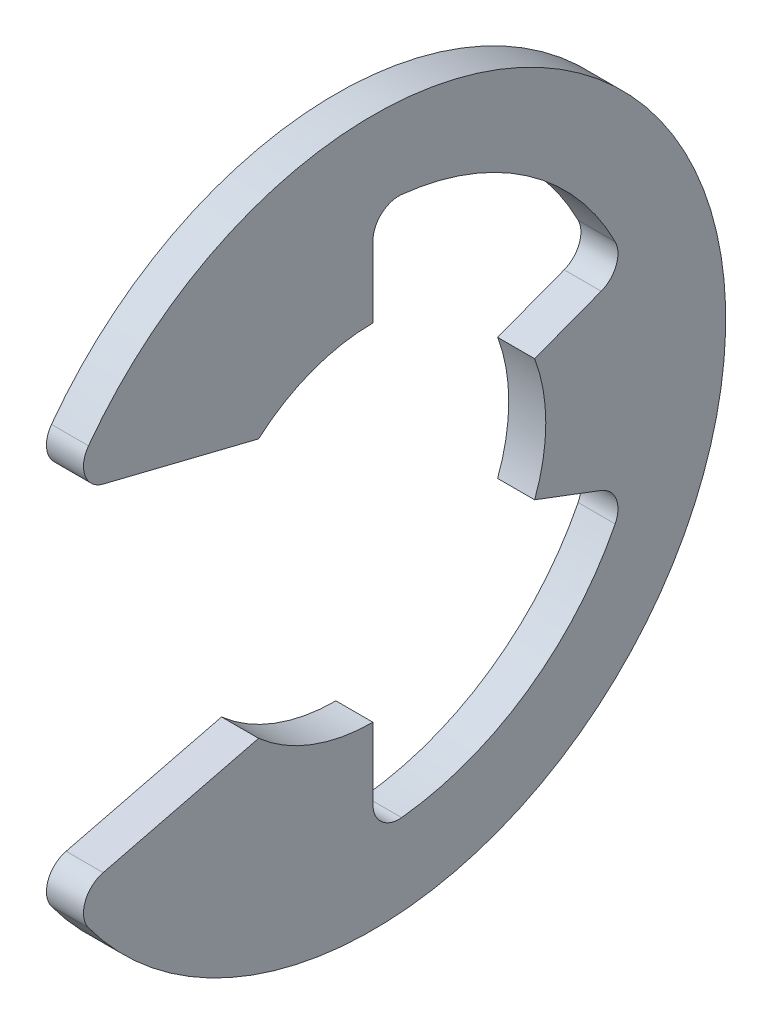
ISO-10303-21;
HEADER;
FILE_DESCRIPTION(('STEP AP214'),'2;1');
FILE_NAME('part.step','',(''),(''),'','','');
FILE_SCHEMA(('AUTOMOTIVE_DESIGN { 1 0 10303 214 1 1 1 1 }'));
ENDSEC;
DATA;
#1=APPLICATION_CONTEXT('core data for automotive mechanical design processes');
#2=APPLICATION_PROTOCOL_DEFINITION('international standard','automotive_design',2000,#1);
#3=PRODUCT_CONTEXT('',#1,'mechanical');
#4=PRODUCT('Part','Part','',(#3));
#5=PRODUCT_RELATED_PRODUCT_CATEGORY('part','',(#4));
#6=PRODUCT_DEFINITION_FORMATION('','',#4);
#7=PRODUCT_DEFINITION_CONTEXT('part definition',#1,'design');
#8=PRODUCT_DEFINITION('design','',#6,#7);
#9=PRODUCT_DEFINITION_SHAPE('','',#8);
#10=(LENGTH_UNIT() NAMED_UNIT(*) SI_UNIT(.MILLI.,.METRE.));
#11=(NAMED_UNIT(*) PLANE_ANGLE_UNIT() SI_UNIT($,.RADIAN.));
#12=(NAMED_UNIT(*) SI_UNIT($,.STERADIAN.) SOLID_ANGLE_UNIT());
#13=UNCERTAINTY_MEASURE_WITH_UNIT(LENGTH_MEASURE(1.E-05),#10,'distance_accuracy_value','');
#14=(GEOMETRIC_REPRESENTATION_CONTEXT(3) GLOBAL_UNCERTAINTY_ASSIGNED_CONTEXT((#13)) GLOBAL_UNIT_ASSIGNED_CONTEXT((#10,
#11,#12)) REPRESENTATION_CONTEXT('',''));
#15=CARTESIAN_POINT('',(0.,0.,0.));
#16=DIRECTION('',(0.,0.,1.));
#17=DIRECTION('',(1.,0.,0.));
#18=AXIS2_PLACEMENT_3D('',#15,#16,#17);
#19=CARTESIAN_POINT('',(0.5334,0.,0.));
#20=DIRECTION('',(-1.,0.,0.));
#21=DIRECTION('',(0.,0.,1.));
#22=AXIS2_PLACEMENT_3D('',#19,#20,#21);
#23=CYLINDRICAL_SURFACE('',#22,10.16);
#24=CARTESIAN_POINT('',(0.5334,0.,0.));
#25=DIRECTION('',(1.,0.,0.));
#26=DIRECTION('',(0.,0.,-1.));
#27=AXIS2_PLACEMENT_3D('',#24,#25,#26);
#28=CIRCLE('',#27,10.16);
#29=CARTESIAN_POINT('',(0.5334,-6.01157023801035,8.19064242129201));
#30=VERTEX_POINT('',#29);
#31=CARTESIAN_POINT('',(0.5334,6.01157023801035,8.19064242129201));
#32=VERTEX_POINT('',#31);
#33=EDGE_CURVE('E173',#30,#32,#28,.T.);
#34=ORIENTED_EDGE('',*,*,#33,.F.);
#35=DIRECTION('',(-1.,0.,0.));
#36=VECTOR('',#35,1.);
#37=CARTESIAN_POINT('',(0.5334,-6.01157023801035,8.19064242129201));
#38=LINE('',#37,#36);
#39=CARTESIAN_POINT('',(-0.5334,-6.01157023801035,8.19064242129201));
#40=VERTEX_POINT('',#39);
#41=EDGE_CURVE('E267',#30,#40,#38,.T.);
#42=ORIENTED_EDGE('',*,*,#41,.T.);
#43=CARTESIAN_POINT('',(-0.5334,0.,0.));
#44=DIRECTION('',(1.,0.,0.));
#45=DIRECTION('',(0.,0.,-1.));
#46=AXIS2_PLACEMENT_3D('',#43,#44,#45);
#47=CIRCLE('',#46,10.16);
#48=CARTESIAN_POINT('',(-0.5334,6.01157023801035,8.19064242129201));
#49=VERTEX_POINT('',#48);
#50=EDGE_CURVE('E211',#40,#49,#47,.T.);
#51=ORIENTED_EDGE('',*,*,#50,.T.);
#52=DIRECTION('',(-1.,0.,0.));
#53=VECTOR('',#52,1.);
#54=CARTESIAN_POINT('',(0.5334,6.01157023801035,8.19064242129201));
#55=LINE('',#54,#53);
#56=EDGE_CURVE('E265',#49,#32,#55,.F.);
#57=ORIENTED_EDGE('',*,*,#56,.T.);
#58=EDGE_LOOP('',(#34,#42,#51,#57));
#59=FACE_BOUND('',#58,.T.);
#60=ADVANCED_FACE('F35',(#59),#23,.T.);
#61=CARTESIAN_POINT('',(0.5334,5.09813480407811,8.78832302088672));
#62=DIRECTION('',(0.,0.970536829925373,-0.240952820606873));
#63=DIRECTION('',(0.,0.240952820606873,0.970536829925373));
#64=AXIS2_PLACEMENT_3D('',#61,#62,#63);
#65=PLANE('',#64);
#66=DIRECTION('',(0.,-0.240952820606873,-0.970536829925373));
#67=VECTOR('',#66,1.);
#68=CARTESIAN_POINT('',(0.5334,5.09813480407811,8.78832302088672));
#69=LINE('',#68,#67);
#70=CARTESIAN_POINT('',(0.5334,4.84496174240152,7.76856413164343));
#71=VERTEX_POINT('',#70);
#72=CARTESIAN_POINT('',(0.5334,3.7338,3.29290208175099));
#73=VERTEX_POINT('',#72);
#74=EDGE_CURVE('E159',#71,#73,#69,.T.);
#75=ORIENTED_EDGE('',*,*,#74,.F.);
#76=DIRECTION('',(-1.,0.,0.));
#77=VECTOR('',#76,1.);
#78=CARTESIAN_POINT('',(0.5334,4.84496174240152,7.76856413164343));
#79=LINE('',#78,#77);
#80=CARTESIAN_POINT('',(-0.5334,4.84496174240152,7.76856413164343));
#81=VERTEX_POINT('',#80);
#82=EDGE_CURVE('E279',#71,#81,#79,.T.);
#83=ORIENTED_EDGE('',*,*,#82,.T.);
#84=DIRECTION('',(0.,-0.240952820606873,-0.970536829925373));
#85=VECTOR('',#84,1.);
#86=CARTESIAN_POINT('',(-0.5334,5.09813480407811,8.78832302088672));
#87=LINE('',#86,#85);
#88=CARTESIAN_POINT('',(-0.5334,3.7338,3.29290208175099));
#89=VERTEX_POINT('',#88);
#90=EDGE_CURVE('E179',#81,#89,#87,.T.);
#91=ORIENTED_EDGE('',*,*,#90,.T.);
#92=DIRECTION('',(-1.,0.,0.));
#93=VECTOR('',#92,1.);
#94=CARTESIAN_POINT('',(0.5334,3.7338,3.29290208175099));
#95=LINE('',#94,#93);
#96=EDGE_CURVE('E176',#73,#89,#95,.T.);
#97=ORIENTED_EDGE('',*,*,#96,.F.);
#98=EDGE_LOOP('',(#75,#83,#91,#97));
#99=FACE_BOUND('',#98,.T.);
#100=ADVANCED_FACE('F177',(#99),#65,.F.);
#101=CARTESIAN_POINT('',(0.5334,0.,0.));
#102=DIRECTION('',(-1.,0.,0.));
#103=DIRECTION('',(0.,0.,1.));
#104=AXIS2_PLACEMENT_3D('',#101,#102,#103);
#105=CYLINDRICAL_SURFACE('',#104,4.9784);
#106=CARTESIAN_POINT('',(-0.5334,0.,0.));
#107=DIRECTION('',(-1.,0.,0.));
#108=DIRECTION('',(0.,0.,1.));
#109=AXIS2_PLACEMENT_3D('',#106,#107,#108);
#110=CIRCLE('',#109,4.9784);
#111=CARTESIAN_POINT('',(-0.5334,4.9784,0.));
#112=VERTEX_POINT('',#111);
#113=EDGE_CURVE('E215',#89,#112,#110,.T.);
#114=ORIENTED_EDGE('',*,*,#113,.T.);
#115=DIRECTION('',(-1.,0.,0.));
#116=VECTOR('',#115,1.);
#117=CARTESIAN_POINT('',(0.5334,4.9784,0.));
#118=LINE('',#117,#116);
#119=CARTESIAN_POINT('',(0.5334,4.9784,0.));
#120=VERTEX_POINT('',#119);
#121=EDGE_CURVE('E183',#120,#112,#118,.T.);
#122=ORIENTED_EDGE('',*,*,#121,.F.);
#123=CARTESIAN_POINT('',(0.5334,0.,0.));
#124=DIRECTION('',(-1.,0.,0.));
#125=DIRECTION('',(0.,0.,1.));
#126=AXIS2_PLACEMENT_3D('',#123,#124,#125);
#127=CIRCLE('',#126,4.9784);
#128=EDGE_CURVE('E165',#73,#120,#127,.T.);
#129=ORIENTED_EDGE('',*,*,#128,.F.);
#130=ORIENTED_EDGE('',*,*,#96,.T.);
#131=EDGE_LOOP('',(#114,#122,#129,#130));
#132=FACE_BOUND('',#131,.T.);
#133=ADVANCED_FACE('F185',(#132),#105,.F.);
#134=CARTESIAN_POINT('',(0.5334,4.9784,0.));
#135=DIRECTION('',(0.,0.,1.));
#136=DIRECTION('',(0.,-1.,0.));
#137=AXIS2_PLACEMENT_3D('',#134,#135,#136);
#138=PLANE('',#137);
#139=DIRECTION('',(0.,1.,0.));
#140=VECTOR('',#139,1.);
#141=CARTESIAN_POINT('',(-0.5334,4.9784,0.));
#142=LINE('',#141,#140);
#143=CARTESIAN_POINT('',(-0.5334,7.02704023617216,0.));
#144=VERTEX_POINT('',#143);
#145=EDGE_CURVE('E217',#112,#144,#142,.T.);
#146=ORIENTED_EDGE('',*,*,#145,.T.);
#147=DIRECTION('',(1.,0.,0.));
#148=VECTOR('',#147,1.);
#149=CARTESIAN_POINT('',(0.5334,7.02704023617216,0.));
#150=LINE('',#149,#148);
#151=CARTESIAN_POINT('',(0.5334,7.02704023617216,0.));
#152=VERTEX_POINT('',#151);
#153=EDGE_CURVE('E263',#144,#152,#150,.T.);
#154=ORIENTED_EDGE('',*,*,#153,.T.);
#155=DIRECTION('',(0.,1.,0.));
#156=VECTOR('',#155,1.);
#157=CARTESIAN_POINT('',(0.5334,4.9784,0.));
#158=LINE('',#157,#156);
#159=EDGE_CURVE('E188',#120,#152,#158,.T.);
#160=ORIENTED_EDGE('',*,*,#159,.F.);
#161=ORIENTED_EDGE('',*,*,#121,.T.);
#162=EDGE_LOOP('',(#146,#154,#160,#161));
#163=FACE_BOUND('',#162,.T.);
#164=ADVANCED_FACE('F385',(#163),#138,.F.);
#165=CARTESIAN_POINT('',(0.5334,0.,0.));
#166=DIRECTION('',(-1.,0.,0.));
#167=DIRECTION('',(0.,0.,1.));
#168=AXIS2_PLACEMENT_3D('',#165,#166,#167);
#169=CYLINDRICAL_SURFACE('',#168,7.81336774193549);
#170=CARTESIAN_POINT('',(0.5334,0.,0.));
#171=DIRECTION('',(-1.,0.,0.));
#172=DIRECTION('',(0.,0.,-1.));
#173=AXIS2_PLACEMENT_3D('',#170,#171,#172);
#174=CIRCLE('',#173,7.81336774193549);
#175=CARTESIAN_POINT('',(0.5334,7.76961896112721,-0.825673464276603));
#176=VERTEX_POINT('',#175);
#177=CARTESIAN_POINT('',(0.5334,3.51932193149276,-6.97589339176224));
#178=VERTEX_POINT('',#177);
#179=EDGE_CURVE('E190',#176,#178,#174,.T.);
#180=ORIENTED_EDGE('',*,*,#179,.F.);
#181=DIRECTION('',(-1.,0.,0.));
#182=VECTOR('',#181,1.);
#183=CARTESIAN_POINT('',(0.5334,7.76961896112721,-0.825673464276603));
#184=LINE('',#183,#182);
#185=CARTESIAN_POINT('',(-0.5334,7.76961896112721,-0.825673464276603));
#186=VERTEX_POINT('',#185);
#187=EDGE_CURVE('E260',#176,#186,#184,.T.);
#188=ORIENTED_EDGE('',*,*,#187,.T.);
#189=CARTESIAN_POINT('',(-0.5334,0.,0.));
#190=DIRECTION('',(-1.,0.,0.));
#191=DIRECTION('',(0.,0.,-1.));
#192=AXIS2_PLACEMENT_3D('',#189,#190,#191);
#193=CIRCLE('',#192,7.81336774193549);
#194=CARTESIAN_POINT('',(-0.5334,3.51932193149276,-6.97589339176224));
#195=VERTEX_POINT('',#194);
#196=EDGE_CURVE('E220',#186,#195,#193,.T.);
#197=ORIENTED_EDGE('',*,*,#196,.T.);
#198=DIRECTION('',(-1.,0.,0.));
#199=VECTOR('',#198,1.);
#200=CARTESIAN_POINT('',(0.5334,3.51932193149276,-6.97589339176224));
#201=LINE('',#200,#199);
#202=EDGE_CURVE('E258',#195,#178,#201,.F.);
#203=ORIENTED_EDGE('',*,*,#202,.T.);
#204=EDGE_LOOP('',(#180,#188,#197,#203));
#205=FACE_BOUND('',#204,.T.);
#206=ADVANCED_FACE('F307',(#205),#169,.F.);
#207=CARTESIAN_POINT('',(0.5334,1.76013019972955,-4.65686678357885));
#208=DIRECTION('',(0.,-0.935414346693485,-0.353553390593274));
#209=DIRECTION('',(0.,0.353553390593274,-0.935414346693485));
#210=AXIS2_PLACEMENT_3D('',#207,#208,#209);
#211=PLANE('',#210);
#212=DIRECTION('',(0.,-0.353553390593274,0.935414346693485));
#213=VECTOR('',#212,1.);
#214=CARTESIAN_POINT('',(0.5334,1.76013019972955,-4.65686678357885));
#215=LINE('',#214,#213);
#216=CARTESIAN_POINT('',(0.5334,2.48443390133403,-6.57319425170782));
#217=VERTEX_POINT('',#216);
#218=CARTESIAN_POINT('',(0.5334,1.76013019972956,-4.65686678357885));
#219=VERTEX_POINT('',#218);
#220=EDGE_CURVE('E195',#217,#219,#215,.T.);
#221=ORIENTED_EDGE('',*,*,#220,.F.);
#222=DIRECTION('',(1.,0.,0.));
#223=VECTOR('',#222,1.);
#224=CARTESIAN_POINT('',(-0.5334,2.48443390133403,-6.57319425170782));
#225=LINE('',#224,#223);
#226=CARTESIAN_POINT('',(-0.5334,2.48443390133403,-6.57319425170782));
#227=VERTEX_POINT('',#226);
#228=EDGE_CURVE('E282',#217,#227,#225,.F.);
#229=ORIENTED_EDGE('',*,*,#228,.T.);
#230=DIRECTION('',(0.,-0.353553390593274,0.935414346693485));
#231=VECTOR('',#230,1.);
#232=CARTESIAN_POINT('',(-0.5334,1.76013019972955,-4.65686678357885));
#233=LINE('',#232,#231);
#234=CARTESIAN_POINT('',(-0.5334,1.76013019972956,-4.65686678357885));
#235=VERTEX_POINT('',#234);
#236=EDGE_CURVE('E223',#227,#235,#233,.T.);
#237=ORIENTED_EDGE('',*,*,#236,.T.);
#238=DIRECTION('',(-1.,0.,0.));
#239=VECTOR('',#238,1.);
#240=CARTESIAN_POINT('',(0.5334,1.76013019972956,-4.65686678357885));
#241=LINE('',#240,#239);
#242=EDGE_CURVE('E247',#219,#235,#241,.T.);
#243=ORIENTED_EDGE('',*,*,#242,.F.);
#244=EDGE_LOOP('',(#221,#229,#237,#243));
#245=FACE_BOUND('',#244,.T.);
#246=ADVANCED_FACE('F310',(#245),#211,.F.);
#247=CARTESIAN_POINT('',(0.5334,0.,0.));
#248=DIRECTION('',(-1.,0.,0.));
#249=DIRECTION('',(0.,0.,1.));
#250=AXIS2_PLACEMENT_3D('',#247,#248,#249);
#251=CYLINDRICAL_SURFACE('',#250,4.9784);
#252=CARTESIAN_POINT('',(-0.5334,0.,0.));
#253=DIRECTION('',(-1.,0.,0.));
#254=DIRECTION('',(0.,0.,1.));
#255=AXIS2_PLACEMENT_3D('',#252,#253,#254);
#256=CIRCLE('',#255,4.9784);
#257=CARTESIAN_POINT('',(-0.5334,-1.76013019972955,-4.65686678357885));
#258=VERTEX_POINT('',#257);
#259=EDGE_CURVE('E225',#235,#258,#256,.T.);
#260=ORIENTED_EDGE('',*,*,#259,.T.);
#261=DIRECTION('',(-1.,0.,0.));
#262=VECTOR('',#261,1.);
#263=CARTESIAN_POINT('',(0.5334,-1.76013019972955,-4.65686678357885));
#264=LINE('',#263,#262);
#265=CARTESIAN_POINT('',(0.5334,-1.76013019972955,-4.65686678357885));
#266=VERTEX_POINT('',#265);
#267=EDGE_CURVE('E244',#266,#258,#264,.T.);
#268=ORIENTED_EDGE('',*,*,#267,.F.);
#269=CARTESIAN_POINT('',(0.5334,0.,0.));
#270=DIRECTION('',(-1.,0.,0.));
#271=DIRECTION('',(0.,0.,1.));
#272=AXIS2_PLACEMENT_3D('',#269,#270,#271);
#273=CIRCLE('',#272,4.9784);
#274=EDGE_CURVE('E197',#219,#266,#273,.T.);
#275=ORIENTED_EDGE('',*,*,#274,.F.);
#276=ORIENTED_EDGE('',*,*,#242,.T.);
#277=EDGE_LOOP('',(#260,#268,#275,#276));
#278=FACE_BOUND('',#277,.T.);
#279=ADVANCED_FACE('F316',(#278),#251,.F.);
#280=CARTESIAN_POINT('',(0.5334,-1.76013019972955,-4.65686678357885));
#281=DIRECTION('',(0.,0.935414346693485,-0.353553390593274));
#282=DIRECTION('',(0.,0.353553390593274,0.935414346693485));
#283=AXIS2_PLACEMENT_3D('',#280,#281,#282);
#284=PLANE('',#283);
#285=DIRECTION('',(0.,-0.353553390593274,-0.935414346693485));
#286=VECTOR('',#285,1.);
#287=CARTESIAN_POINT('',(-0.5334,-1.76013019972955,-4.65686678357885));
#288=LINE('',#287,#286);
#289=CARTESIAN_POINT('',(-0.5334,-2.48443390133403,-6.57319425170782));
#290=VERTEX_POINT('',#289);
#291=EDGE_CURVE('E227',#258,#290,#288,.T.);
#292=ORIENTED_EDGE('',*,*,#291,.T.);
#293=DIRECTION('',(1.,0.,0.));
#294=VECTOR('',#293,1.);
#295=CARTESIAN_POINT('',(0.5334,-2.48443390133403,-6.57319425170782));
#296=LINE('',#295,#294);
#297=CARTESIAN_POINT('',(0.5334,-2.48443390133403,-6.57319425170782));
#298=VERTEX_POINT('',#297);
#299=EDGE_CURVE('E50',#290,#298,#296,.T.);
#300=ORIENTED_EDGE('',*,*,#299,.T.);
#301=DIRECTION('',(0.,-0.353553390593274,-0.935414346693485));
#302=VECTOR('',#301,1.);
#303=CARTESIAN_POINT('',(0.5334,-1.76013019972955,-4.65686678357885));
#304=LINE('',#303,#302);
#305=EDGE_CURVE('E199',#266,#298,#304,.T.);
#306=ORIENTED_EDGE('',*,*,#305,.F.);
#307=ORIENTED_EDGE('',*,*,#267,.T.);
#308=EDGE_LOOP('',(#292,#300,#306,#307));
#309=FACE_BOUND('',#308,.T.);
#310=ADVANCED_FACE('F318',(#309),#284,.F.);
#311=CARTESIAN_POINT('',(0.5334,0.,0.));
#312=DIRECTION('',(-1.,0.,0.));
#313=DIRECTION('',(0.,0.,1.));
#314=AXIS2_PLACEMENT_3D('',#311,#312,#313);
#315=CYLINDRICAL_SURFACE('',#314,7.81336774193549);
#316=CARTESIAN_POINT('',(-0.5334,0.,0.));
#317=DIRECTION('',(-1.,0.,0.));
#318=DIRECTION('',(0.,0.,-1.));
#319=AXIS2_PLACEMENT_3D('',#316,#317,#318);
#320=CIRCLE('',#319,7.81336774193549);
#321=CARTESIAN_POINT('',(-0.5334,-3.51932193149276,-6.97589339176224));
#322=VERTEX_POINT('',#321);
#323=CARTESIAN_POINT('',(-0.5334,-7.76961896112721,-0.825673464276605));
#324=VERTEX_POINT('',#323);
#325=EDGE_CURVE('E229',#322,#324,#320,.T.);
#326=ORIENTED_EDGE('',*,*,#325,.T.);
#327=DIRECTION('',(-1.,0.,0.));
#328=VECTOR('',#327,1.);
#329=CARTESIAN_POINT('',(0.5334,-7.76961896112721,-0.825673464276605));
#330=LINE('',#329,#328);
#331=CARTESIAN_POINT('',(0.5334,-7.76961896112721,-0.825673464276605));
#332=VERTEX_POINT('',#331);
#333=EDGE_CURVE('E256',#324,#332,#330,.F.);
#334=ORIENTED_EDGE('',*,*,#333,.T.);
#335=CARTESIAN_POINT('',(0.5334,0.,0.));
#336=DIRECTION('',(-1.,0.,0.));
#337=DIRECTION('',(0.,0.,-1.));
#338=AXIS2_PLACEMENT_3D('',#335,#336,#337);
#339=CIRCLE('',#338,7.81336774193549);
#340=CARTESIAN_POINT('',(0.5334,-3.51932193149276,-6.97589339176224));
#341=VERTEX_POINT('',#340);
#342=EDGE_CURVE('E201',#341,#332,#339,.T.);
#343=ORIENTED_EDGE('',*,*,#342,.F.);
#344=DIRECTION('',(-1.,0.,0.));
#345=VECTOR('',#344,1.);
#346=CARTESIAN_POINT('',(0.5334,-3.51932193149276,-6.97589339176224));
#347=LINE('',#346,#345);
#348=EDGE_CURVE('E253',#341,#322,#347,.T.);
#349=ORIENTED_EDGE('',*,*,#348,.T.);
#350=EDGE_LOOP('',(#326,#334,#343,#349));
#351=FACE_BOUND('',#350,.T.);
#352=ADVANCED_FACE('F320',(#351),#315,.F.);
#353=CARTESIAN_POINT('',(0.5334,-4.9784,0.));
#354=DIRECTION('',(0.,0.,1.));
#355=DIRECTION('',(0.,-1.,0.));
#356=AXIS2_PLACEMENT_3D('',#353,#354,#355);
#357=PLANE('',#356);
#358=DIRECTION('',(0.,1.,0.));
#359=VECTOR('',#358,1.);
#360=CARTESIAN_POINT('',(0.5334,-4.9784,0.));
#361=LINE('',#360,#359);
#362=CARTESIAN_POINT('',(0.5334,-7.02704023617216,0.));
#363=VERTEX_POINT('',#362);
#364=CARTESIAN_POINT('',(0.5334,-4.9784,0.));
#365=VERTEX_POINT('',#364);
#366=EDGE_CURVE('E204',#363,#365,#361,.T.);
#367=ORIENTED_EDGE('',*,*,#366,.F.);
#368=DIRECTION('',(1.,0.,0.));
#369=VECTOR('',#368,1.);
#370=CARTESIAN_POINT('',(-0.5334,-7.02704023617216,0.));
#371=LINE('',#370,#369);
#372=CARTESIAN_POINT('',(-0.5334,-7.02704023617216,0.));
#373=VERTEX_POINT('',#372);
#374=EDGE_CURVE('E182',#363,#373,#371,.F.);
#375=ORIENTED_EDGE('',*,*,#374,.T.);
#376=DIRECTION('',(0.,1.,0.));
#377=VECTOR('',#376,1.);
#378=CARTESIAN_POINT('',(-0.5334,-4.9784,0.));
#379=LINE('',#378,#377);
#380=CARTESIAN_POINT('',(-0.5334,-4.9784,0.));
#381=VERTEX_POINT('',#380);
#382=EDGE_CURVE('E232',#373,#381,#379,.T.);
#383=ORIENTED_EDGE('',*,*,#382,.T.);
#384=DIRECTION('',(-1.,0.,0.));
#385=VECTOR('',#384,1.);
#386=CARTESIAN_POINT('',(0.5334,-4.9784,0.));
#387=LINE('',#386,#385);
#388=EDGE_CURVE('E241',#365,#381,#387,.T.);
#389=ORIENTED_EDGE('',*,*,#388,.F.);
#390=EDGE_LOOP('',(#367,#375,#383,#389));
#391=FACE_BOUND('',#390,.T.);
#392=ADVANCED_FACE('F326',(#391),#357,.F.);
#393=CARTESIAN_POINT('',(0.5334,0.,0.));
#394=DIRECTION('',(-1.,0.,0.));
#395=DIRECTION('',(0.,0.,1.));
#396=AXIS2_PLACEMENT_3D('',#393,#394,#395);
#397=CYLINDRICAL_SURFACE('',#396,4.9784);
#398=CARTESIAN_POINT('',(-0.5334,0.,0.));
#399=DIRECTION('',(-1.,0.,0.));
#400=DIRECTION('',(0.,0.,-1.));
#401=AXIS2_PLACEMENT_3D('',#398,#399,#400);
#402=CIRCLE('',#401,4.9784);
#403=CARTESIAN_POINT('',(-0.5334,-3.7338,3.29290208175099));
#404=VERTEX_POINT('',#403);
#405=EDGE_CURVE('E234',#381,#404,#402,.T.);
#406=ORIENTED_EDGE('',*,*,#405,.T.);
#407=DIRECTION('',(-1.,0.,0.));
#408=VECTOR('',#407,1.);
#409=CARTESIAN_POINT('',(0.5334,-3.7338,3.29290208175099));
#410=LINE('',#409,#408);
#411=CARTESIAN_POINT('',(0.5334,-3.7338,3.29290208175099));
#412=VERTEX_POINT('',#411);
#413=EDGE_CURVE('E210',#412,#404,#410,.T.);
#414=ORIENTED_EDGE('',*,*,#413,.F.);
#415=CARTESIAN_POINT('',(0.5334,0.,0.));
#416=DIRECTION('',(-1.,0.,0.));
#417=DIRECTION('',(0.,0.,-1.));
#418=AXIS2_PLACEMENT_3D('',#415,#416,#417);
#419=CIRCLE('',#418,4.9784);
#420=EDGE_CURVE('E206',#365,#412,#419,.T.);
#421=ORIENTED_EDGE('',*,*,#420,.F.);
#422=ORIENTED_EDGE('',*,*,#388,.T.);
#423=EDGE_LOOP('',(#406,#414,#421,#422));
#424=FACE_BOUND('',#423,.T.);
#425=ADVANCED_FACE('F375',(#424),#397,.F.);
#426=CARTESIAN_POINT('',(0.5334,-5.09813480407811,8.78832302088672));
#427=DIRECTION('',(0.,-0.970536829925373,-0.240952820606873));
#428=DIRECTION('',(0.,0.240952820606873,-0.970536829925373));
#429=AXIS2_PLACEMENT_3D('',#426,#427,#428);
#430=PLANE('',#429);
#431=DIRECTION('',(0.,-0.240952820606873,0.970536829925373));
#432=VECTOR('',#431,1.);
#433=CARTESIAN_POINT('',(-0.5334,-5.09813480407811,8.78832302088672));
#434=LINE('',#433,#432);
#435=CARTESIAN_POINT('',(-0.5334,-4.84496174240152,7.76856413164343));
#436=VERTEX_POINT('',#435);
#437=EDGE_CURVE('E236',#404,#436,#434,.T.);
#438=ORIENTED_EDGE('',*,*,#437,.T.);
#439=DIRECTION('',(-1.,0.,0.));
#440=VECTOR('',#439,1.);
#441=CARTESIAN_POINT('',(0.5334,-4.84496174240152,7.76856413164343));
#442=LINE('',#441,#440);
#443=CARTESIAN_POINT('',(0.5334,-4.84496174240152,7.76856413164343));
#444=VERTEX_POINT('',#443);
#445=EDGE_CURVE('E274',#436,#444,#442,.F.);
#446=ORIENTED_EDGE('',*,*,#445,.T.);
#447=DIRECTION('',(0.,-0.240952820606873,0.970536829925373));
#448=VECTOR('',#447,1.);
#449=CARTESIAN_POINT('',(0.5334,-5.09813480407811,8.78832302088672));
#450=LINE('',#449,#448);
#451=EDGE_CURVE('E208',#412,#444,#450,.T.);
#452=ORIENTED_EDGE('',*,*,#451,.F.);
#453=ORIENTED_EDGE('',*,*,#413,.T.);
#454=EDGE_LOOP('',(#438,#446,#452,#453));
#455=FACE_BOUND('',#454,.T.);
#456=ADVANCED_FACE('F417',(#455),#430,.F.);
#457=CARTESIAN_POINT('',(0.5334,0.,0.));
#458=DIRECTION('',(1.,0.,0.));
#459=DIRECTION('',(0.,0.,-1.));
#460=AXIS2_PLACEMENT_3D('',#457,#458,#459);
#461=PLANE('',#460);
#462=ORIENTED_EDGE('',*,*,#451,.T.);
#463=CARTESIAN_POINT('',(0.5334,-5.56971982551659,7.58863020332705));
#464=DIRECTION('',(1.,0.,0.));
#465=DIRECTION('',(0.,0.,-1.));
#466=AXIS2_PLACEMENT_3D('',#463,#464,#465);
#467=CIRCLE('',#466,0.74676);
#468=EDGE_CURVE('E277',#444,#30,#467,.T.);
#469=ORIENTED_EDGE('',*,*,#468,.T.);
#470=ORIENTED_EDGE('',*,*,#33,.T.);
#471=CARTESIAN_POINT('',(0.5334,5.56971982551659,7.58863020332705));
#472=DIRECTION('',(1.,0.,0.));
#473=DIRECTION('',(0.,0.,-1.));
#474=AXIS2_PLACEMENT_3D('',#471,#472,#473);
#475=CIRCLE('',#474,0.74676);
#476=EDGE_CURVE('E169',#32,#71,#475,.T.);
#477=ORIENTED_EDGE('',*,*,#476,.T.);
#478=ORIENTED_EDGE('',*,*,#74,.T.);
#479=ORIENTED_EDGE('',*,*,#128,.T.);
#480=ORIENTED_EDGE('',*,*,#159,.T.);
#481=CARTESIAN_POINT('',(0.5334,7.02704023617216,-0.746759999999999));
#482=DIRECTION('',(1.,0.,0.));
#483=DIRECTION('',(0.,0.,-1.));
#484=AXIS2_PLACEMENT_3D('',#481,#482,#483);
#485=CIRCLE('',#484,0.74676);
#486=EDGE_CURVE('E291',#152,#176,#485,.F.);
#487=ORIENTED_EDGE('',*,*,#486,.T.);
#488=ORIENTED_EDGE('',*,*,#179,.T.);
#489=CARTESIAN_POINT('',(0.5334,3.18296391887086,-6.30917472174839));
#490=DIRECTION('',(1.,0.,0.));
#491=DIRECTION('',(0.,0.,-1.));
#492=AXIS2_PLACEMENT_3D('',#489,#490,#491);
#493=CIRCLE('',#492,0.74676);
#494=EDGE_CURVE('E11',#178,#217,#493,.F.);
#495=ORIENTED_EDGE('',*,*,#494,.T.);
#496=ORIENTED_EDGE('',*,*,#220,.T.);
#497=ORIENTED_EDGE('',*,*,#274,.T.);
#498=ORIENTED_EDGE('',*,*,#305,.T.);
#499=CARTESIAN_POINT('',(0.5334,-3.18296391887085,-6.30917472174839));
#500=DIRECTION('',(1.,0.,0.));
#501=DIRECTION('',(0.,0.,-1.));
#502=AXIS2_PLACEMENT_3D('',#499,#500,#501);
#503=CIRCLE('',#502,0.74676);
#504=EDGE_CURVE('E295',#298,#341,#503,.F.);
#505=ORIENTED_EDGE('',*,*,#504,.T.);
#506=ORIENTED_EDGE('',*,*,#342,.T.);
#507=CARTESIAN_POINT('',(0.5334,-7.02704023617216,-0.746760000000001));
#508=DIRECTION('',(1.,0.,0.));
#509=DIRECTION('',(0.,0.,-1.));
#510=AXIS2_PLACEMENT_3D('',#507,#508,#509);
#511=CIRCLE('',#510,0.74676);
#512=EDGE_CURVE('E287',#332,#363,#511,.F.);
#513=ORIENTED_EDGE('',*,*,#512,.T.);
#514=ORIENTED_EDGE('',*,*,#366,.T.);
#515=ORIENTED_EDGE('',*,*,#420,.T.);
#516=EDGE_LOOP('',(#462,#469,#470,#477,#478,#479,#480,#487,#488,#495,#496,#497,#498,#505,#506,
#513,#514,#515));
#517=FACE_BOUND('',#516,.T.);
#518=ADVANCED_FACE('F162',(#517),#461,.T.);
#519=CARTESIAN_POINT('',(-0.5334,0.,0.));
#520=DIRECTION('',(1.,0.,0.));
#521=DIRECTION('',(0.,0.,-1.));
#522=AXIS2_PLACEMENT_3D('',#519,#520,#521);
#523=PLANE('',#522);
#524=ORIENTED_EDGE('',*,*,#50,.F.);
#525=CARTESIAN_POINT('',(-0.5334,-5.56971982551659,7.58863020332705));
#526=DIRECTION('',(1.,0.,0.));
#527=DIRECTION('',(0.,0.,-1.));
#528=AXIS2_PLACEMENT_3D('',#525,#526,#527);
#529=CIRCLE('',#528,0.74676);
#530=EDGE_CURVE('E272',#40,#436,#529,.F.);
#531=ORIENTED_EDGE('',*,*,#530,.T.);
#532=ORIENTED_EDGE('',*,*,#437,.F.);
#533=ORIENTED_EDGE('',*,*,#405,.F.);
#534=ORIENTED_EDGE('',*,*,#382,.F.);
#535=CARTESIAN_POINT('',(-0.5334,-7.02704023617216,-0.746760000000001));
#536=DIRECTION('',(1.,0.,0.));
#537=DIRECTION('',(0.,0.,-1.));
#538=AXIS2_PLACEMENT_3D('',#535,#536,#537);
#539=CIRCLE('',#538,0.74676);
#540=EDGE_CURVE('E285',#373,#324,#539,.T.);
#541=ORIENTED_EDGE('',*,*,#540,.T.);
#542=ORIENTED_EDGE('',*,*,#325,.F.);
#543=CARTESIAN_POINT('',(-0.5334,-3.18296391887085,-6.30917472174839));
#544=DIRECTION('',(1.,0.,0.));
#545=DIRECTION('',(0.,0.,-1.));
#546=AXIS2_PLACEMENT_3D('',#543,#544,#545);
#547=CIRCLE('',#546,0.74676);
#548=EDGE_CURVE('E293',#322,#290,#547,.T.);
#549=ORIENTED_EDGE('',*,*,#548,.T.);
#550=ORIENTED_EDGE('',*,*,#291,.F.);
#551=ORIENTED_EDGE('',*,*,#259,.F.);
#552=ORIENTED_EDGE('',*,*,#236,.F.);
#553=CARTESIAN_POINT('',(-0.5334,3.18296391887086,-6.30917472174839));
#554=DIRECTION('',(1.,0.,0.));
#555=DIRECTION('',(0.,0.,-1.));
#556=AXIS2_PLACEMENT_3D('',#553,#554,#555);
#557=CIRCLE('',#556,0.74676);
#558=EDGE_CURVE('E43',#227,#195,#557,.T.);
#559=ORIENTED_EDGE('',*,*,#558,.T.);
#560=ORIENTED_EDGE('',*,*,#196,.F.);
#561=CARTESIAN_POINT('',(-0.5334,7.02704023617216,-0.746759999999999));
#562=DIRECTION('',(1.,0.,0.));
#563=DIRECTION('',(0.,0.,-1.));
#564=AXIS2_PLACEMENT_3D('',#561,#562,#563);
#565=CIRCLE('',#564,0.74676);
#566=EDGE_CURVE('E289',#186,#144,#565,.T.);
#567=ORIENTED_EDGE('',*,*,#566,.T.);
#568=ORIENTED_EDGE('',*,*,#145,.F.);
#569=ORIENTED_EDGE('',*,*,#113,.F.);
#570=ORIENTED_EDGE('',*,*,#90,.F.);
#571=CARTESIAN_POINT('',(-0.5334,5.56971982551659,7.58863020332705));
#572=DIRECTION('',(1.,0.,0.));
#573=DIRECTION('',(0.,0.,-1.));
#574=AXIS2_PLACEMENT_3D('',#571,#572,#573);
#575=CIRCLE('',#574,0.74676);
#576=EDGE_CURVE('E270',#81,#49,#575,.F.);
#577=ORIENTED_EDGE('',*,*,#576,.T.);
#578=EDGE_LOOP('',(#524,#531,#532,#533,#534,#541,#542,#549,#550,#551,#552,#559,#560,#567,#568,
#569,#570,#577));
#579=FACE_BOUND('',#578,.T.);
#580=ADVANCED_FACE('F300',(#579),#523,.F.);
#581=CARTESIAN_POINT('',(0.5334,-7.02704023617216,-0.746760000000001));
#582=DIRECTION('',(-1.,0.,0.));
#583=DIRECTION('',(0.,0.,1.));
#584=AXIS2_PLACEMENT_3D('',#581,#582,#583);
#585=CYLINDRICAL_SURFACE('',#584,0.74676);
#586=ORIENTED_EDGE('',*,*,#512,.F.);
#587=ORIENTED_EDGE('',*,*,#333,.F.);
#588=ORIENTED_EDGE('',*,*,#540,.F.);
#589=ORIENTED_EDGE('',*,*,#374,.F.);
#590=EDGE_LOOP('',(#586,#587,#588,#589));
#591=FACE_BOUND('',#590,.T.);
#592=ADVANCED_FACE('F340',(#591),#585,.F.);
#593=CARTESIAN_POINT('',(0.5334,7.02704023617216,-0.746759999999999));
#594=DIRECTION('',(-1.,0.,0.));
#595=DIRECTION('',(0.,0.,1.));
#596=AXIS2_PLACEMENT_3D('',#593,#594,#595);
#597=CYLINDRICAL_SURFACE('',#596,0.74676);
#598=ORIENTED_EDGE('',*,*,#486,.F.);
#599=ORIENTED_EDGE('',*,*,#153,.F.);
#600=ORIENTED_EDGE('',*,*,#566,.F.);
#601=ORIENTED_EDGE('',*,*,#187,.F.);
#602=EDGE_LOOP('',(#598,#599,#600,#601));
#603=FACE_BOUND('',#602,.T.);
#604=ADVANCED_FACE('F343',(#603),#597,.F.);
#605=CARTESIAN_POINT('',(0.5334,-5.56971982551659,7.58863020332705));
#606=DIRECTION('',(-1.,0.,0.));
#607=DIRECTION('',(0.,0.,1.));
#608=AXIS2_PLACEMENT_3D('',#605,#606,#607);
#609=CYLINDRICAL_SURFACE('',#608,0.74676);
#610=ORIENTED_EDGE('',*,*,#468,.F.);
#611=ORIENTED_EDGE('',*,*,#445,.F.);
#612=ORIENTED_EDGE('',*,*,#530,.F.);
#613=ORIENTED_EDGE('',*,*,#41,.F.);
#614=EDGE_LOOP('',(#610,#611,#612,#613));
#615=FACE_BOUND('',#614,.T.);
#616=ADVANCED_FACE('F347',(#615),#609,.T.);
#617=CARTESIAN_POINT('',(0.5334,5.56971982551659,7.58863020332705));
#618=DIRECTION('',(-1.,0.,0.));
#619=DIRECTION('',(0.,0.,1.));
#620=AXIS2_PLACEMENT_3D('',#617,#618,#619);
#621=CYLINDRICAL_SURFACE('',#620,0.74676);
#622=ORIENTED_EDGE('',*,*,#476,.F.);
#623=ORIENTED_EDGE('',*,*,#56,.F.);
#624=ORIENTED_EDGE('',*,*,#576,.F.);
#625=ORIENTED_EDGE('',*,*,#82,.F.);
#626=EDGE_LOOP('',(#622,#623,#624,#625));
#627=FACE_BOUND('',#626,.T.);
#628=ADVANCED_FACE('F351',(#627),#621,.T.);
#629=CARTESIAN_POINT('',(0.5334,-3.18296391887085,-6.30917472174839));
#630=DIRECTION('',(-1.,0.,0.));
#631=DIRECTION('',(0.,0.,1.));
#632=AXIS2_PLACEMENT_3D('',#629,#630,#631);
#633=CYLINDRICAL_SURFACE('',#632,0.74676);
#634=ORIENTED_EDGE('',*,*,#504,.F.);
#635=ORIENTED_EDGE('',*,*,#299,.F.);
#636=ORIENTED_EDGE('',*,*,#548,.F.);
#637=ORIENTED_EDGE('',*,*,#348,.F.);
#638=EDGE_LOOP('',(#634,#635,#636,#637));
#639=FACE_BOUND('',#638,.T.);
#640=ADVANCED_FACE('F354',(#639),#633,.F.);
#641=CARTESIAN_POINT('',(0.5334,3.18296391887086,-6.30917472174839));
#642=DIRECTION('',(-1.,0.,0.));
#643=DIRECTION('',(0.,0.,1.));
#644=AXIS2_PLACEMENT_3D('',#641,#642,#643);
#645=CYLINDRICAL_SURFACE('',#644,0.74676);
#646=ORIENTED_EDGE('',*,*,#494,.F.);
#647=ORIENTED_EDGE('',*,*,#202,.F.);
#648=ORIENTED_EDGE('',*,*,#558,.F.);
#649=ORIENTED_EDGE('',*,*,#228,.F.);
#650=EDGE_LOOP('',(#646,#647,#648,#649));
#651=FACE_BOUND('',#650,.T.);
#652=ADVANCED_FACE('F37',(#651),#645,.F.);
#653=CLOSED_SHELL('',(#60,#100,#133,#164,#206,#246,#279,#310,#352,#392,#425,#456,#518,#580,#592,
#604,#616,#628,#640,#652));
#654=MANIFOLD_SOLID_BREP('B2',#653);
#655=ADVANCED_BREP_SHAPE_REPRESENTATION('',(#18,#654),#14);
#656=SHAPE_DEFINITION_REPRESENTATION(#9,#655);
ENDSEC;
END-ISO-10303-21;
